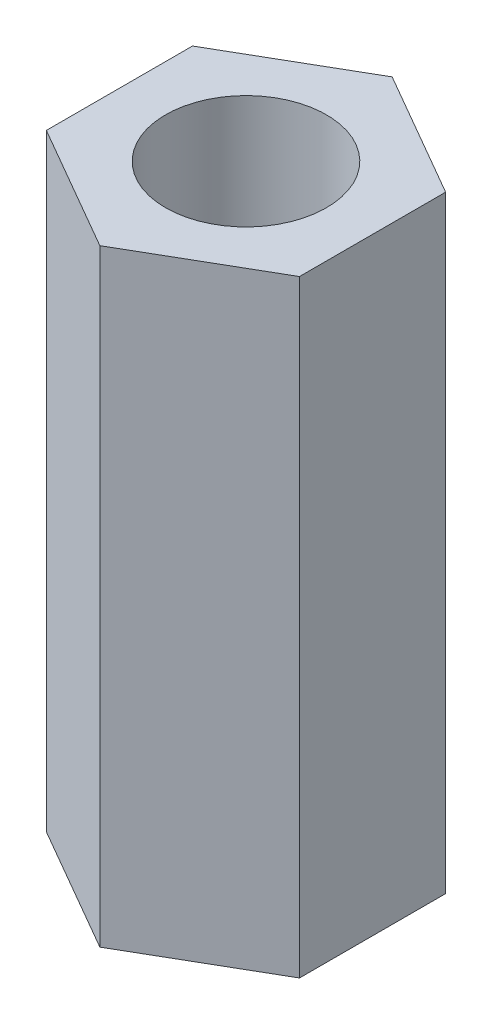
ISO-10303-21;
HEADER;
FILE_DESCRIPTION(('STEP AP214'),'2;1');
FILE_NAME('part.step','',(''),(''),'','','');
FILE_SCHEMA(('AUTOMOTIVE_DESIGN { 1 0 10303 214 1 1 1 1 }'));
ENDSEC;
DATA;
#1=APPLICATION_CONTEXT('core data for automotive mechanical design processes');
#2=APPLICATION_PROTOCOL_DEFINITION('international standard','automotive_design',2000,#1);
#3=PRODUCT_CONTEXT('',#1,'mechanical');
#4=PRODUCT('Part','Part','',(#3));
#5=PRODUCT_RELATED_PRODUCT_CATEGORY('part','',(#4));
#6=PRODUCT_DEFINITION_FORMATION('','',#4);
#7=PRODUCT_DEFINITION_CONTEXT('part definition',#1,'design');
#8=PRODUCT_DEFINITION('design','',#6,#7);
#9=PRODUCT_DEFINITION_SHAPE('','',#8);
#10=(LENGTH_UNIT() NAMED_UNIT(*) SI_UNIT(.MILLI.,.METRE.));
#11=(NAMED_UNIT(*) PLANE_ANGLE_UNIT() SI_UNIT($,.RADIAN.));
#12=(NAMED_UNIT(*) SI_UNIT($,.STERADIAN.) SOLID_ANGLE_UNIT());
#13=UNCERTAINTY_MEASURE_WITH_UNIT(LENGTH_MEASURE(1.E-05),#10,'distance_accuracy_value','');
#14=(GEOMETRIC_REPRESENTATION_CONTEXT(3) GLOBAL_UNCERTAINTY_ASSIGNED_CONTEXT((#13)) GLOBAL_UNIT_ASSIGNED_CONTEXT((#10,
#11,#12)) REPRESENTATION_CONTEXT('',''));
#15=CARTESIAN_POINT('',(0.,0.,0.));
#16=DIRECTION('',(0.,0.,1.));
#17=DIRECTION('',(1.,0.,0.));
#18=AXIS2_PLACEMENT_3D('',#15,#16,#17);
#19=CARTESIAN_POINT('',(0.,12.,0.));
#20=DIRECTION('',(0.,-1.,0.));
#21=DIRECTION('',(0.,0.,-1.));
#22=AXIS2_PLACEMENT_3D('',#19,#20,#21);
#23=PLANE('',#22);
#24=DIRECTION('',(-0.866025403784439,0.,0.5));
#25=VECTOR('',#24,1.);
#26=CARTESIAN_POINT('',(-2.50021534072567,12.,-1.4435));
#27=LINE('',#26,#25);
#28=CARTESIAN_POINT('',(0.,12.,-2.887));
#29=VERTEX_POINT('',#28);
#30=CARTESIAN_POINT('',(-2.50021534072567,12.,-1.4435));
#31=VERTEX_POINT('',#30);
#32=EDGE_CURVE('E130',#29,#31,#27,.T.);
#33=ORIENTED_EDGE('',*,*,#32,.T.);
#34=DIRECTION('',(0.,0.,1.));
#35=VECTOR('',#34,1.);
#36=CARTESIAN_POINT('',(-2.50021534072567,12.,1.4435));
#37=LINE('',#36,#35);
#38=CARTESIAN_POINT('',(-2.50021534072567,12.,1.4435));
#39=VERTEX_POINT('',#38);
#40=EDGE_CURVE('E88',#31,#39,#37,.T.);
#41=ORIENTED_EDGE('',*,*,#40,.T.);
#42=DIRECTION('',(0.866025403784439,0.,0.5));
#43=VECTOR('',#42,1.);
#44=CARTESIAN_POINT('',(0.,12.,2.887));
#45=LINE('',#44,#43);
#46=CARTESIAN_POINT('',(0.,12.,2.887));
#47=VERTEX_POINT('',#46);
#48=EDGE_CURVE('E101',#39,#47,#45,.T.);
#49=ORIENTED_EDGE('',*,*,#48,.T.);
#50=DIRECTION('',(0.866025403784439,0.,-0.5));
#51=VECTOR('',#50,1.);
#52=CARTESIAN_POINT('',(2.50021534072567,12.,1.4435));
#53=LINE('',#52,#51);
#54=CARTESIAN_POINT('',(2.50021534072567,12.,1.4435));
#55=VERTEX_POINT('',#54);
#56=EDGE_CURVE('E95',#47,#55,#53,.T.);
#57=ORIENTED_EDGE('',*,*,#56,.T.);
#58=DIRECTION('',(0.,0.,-1.));
#59=VECTOR('',#58,1.);
#60=CARTESIAN_POINT('',(2.50021534072567,12.,-1.4435));
#61=LINE('',#60,#59);
#62=CARTESIAN_POINT('',(2.50021534072567,12.,-1.4435));
#63=VERTEX_POINT('',#62);
#64=EDGE_CURVE('E99',#55,#63,#61,.T.);
#65=ORIENTED_EDGE('',*,*,#64,.T.);
#66=DIRECTION('',(-0.866025403784439,0.,-0.5));
#67=VECTOR('',#66,1.);
#68=CARTESIAN_POINT('',(0.,12.,-2.887));
#69=LINE('',#68,#67);
#70=EDGE_CURVE('E51',#63,#29,#69,.T.);
#71=ORIENTED_EDGE('',*,*,#70,.T.);
#72=EDGE_LOOP('',(#33,#41,#49,#57,#65,#71));
#73=FACE_BOUND('',#72,.T.);
#74=CARTESIAN_POINT('',(0.,12.,0.));
#75=DIRECTION('',(0.,1.,0.));
#76=DIRECTION('',(0.,0.,1.));
#77=AXIS2_PLACEMENT_3D('',#74,#75,#76);
#78=CIRCLE('',#77,1.59);
#79=CARTESIAN_POINT('',(0.,12.,1.59));
#80=VERTEX_POINT('',#79);
#81=EDGE_CURVE('E123',#80,#80,#78,.T.);
#82=ORIENTED_EDGE('',*,*,#81,.F.);
#83=EDGE_LOOP('',(#82));
#84=FACE_BOUND('',#83,.T.);
#85=ADVANCED_FACE('F34',(#73,#84),#23,.F.);
#86=CARTESIAN_POINT('',(0.,0.,0.));
#87=DIRECTION('',(0.,-1.,0.));
#88=DIRECTION('',(0.,0.,-1.));
#89=AXIS2_PLACEMENT_3D('',#86,#87,#88);
#90=PLANE('',#89);
#91=DIRECTION('',(-0.866025403784439,0.,0.5));
#92=VECTOR('',#91,1.);
#93=CARTESIAN_POINT('',(-2.50021534072567,0.,-1.4435));
#94=LINE('',#93,#92);
#95=CARTESIAN_POINT('',(0.,0.,-2.887));
#96=VERTEX_POINT('',#95);
#97=CARTESIAN_POINT('',(-2.50021534072567,0.,-1.4435));
#98=VERTEX_POINT('',#97);
#99=EDGE_CURVE('E119',#96,#98,#94,.T.);
#100=ORIENTED_EDGE('',*,*,#99,.F.);
#101=DIRECTION('',(-0.866025403784439,0.,-0.5));
#102=VECTOR('',#101,1.);
#103=CARTESIAN_POINT('',(0.,0.,-2.887));
#104=LINE('',#103,#102);
#105=CARTESIAN_POINT('',(2.50021534072567,0.,-1.4435));
#106=VERTEX_POINT('',#105);
#107=EDGE_CURVE('E80',#106,#96,#104,.T.);
#108=ORIENTED_EDGE('',*,*,#107,.F.);
#109=DIRECTION('',(0.,0.,-1.));
#110=VECTOR('',#109,1.);
#111=CARTESIAN_POINT('',(2.50021534072567,0.,-1.4435));
#112=LINE('',#111,#110);
#113=CARTESIAN_POINT('',(2.50021534072567,0.,1.4435));
#114=VERTEX_POINT('',#113);
#115=EDGE_CURVE('E74',#114,#106,#112,.T.);
#116=ORIENTED_EDGE('',*,*,#115,.F.);
#117=DIRECTION('',(0.866025403784439,0.,-0.5));
#118=VECTOR('',#117,1.);
#119=CARTESIAN_POINT('',(2.50021534072567,0.,1.4435));
#120=LINE('',#119,#118);
#121=CARTESIAN_POINT('',(0.,0.,2.887));
#122=VERTEX_POINT('',#121);
#123=EDGE_CURVE('E109',#122,#114,#120,.T.);
#124=ORIENTED_EDGE('',*,*,#123,.F.);
#125=DIRECTION('',(0.866025403784439,0.,0.5));
#126=VECTOR('',#125,1.);
#127=CARTESIAN_POINT('',(0.,0.,2.887));
#128=LINE('',#127,#126);
#129=CARTESIAN_POINT('',(-2.50021534072567,0.,1.4435));
#130=VERTEX_POINT('',#129);
#131=EDGE_CURVE('E125',#130,#122,#128,.T.);
#132=ORIENTED_EDGE('',*,*,#131,.F.);
#133=DIRECTION('',(0.,0.,1.));
#134=VECTOR('',#133,1.);
#135=CARTESIAN_POINT('',(-2.50021534072567,0.,1.4435));
#136=LINE('',#135,#134);
#137=EDGE_CURVE('E122',#98,#130,#136,.T.);
#138=ORIENTED_EDGE('',*,*,#137,.F.);
#139=EDGE_LOOP('',(#100,#108,#116,#124,#132,#138));
#140=FACE_BOUND('',#139,.T.);
#141=CARTESIAN_POINT('',(0.,0.,0.));
#142=DIRECTION('',(0.,1.,0.));
#143=DIRECTION('',(0.,0.,1.));
#144=AXIS2_PLACEMENT_3D('',#141,#142,#143);
#145=CIRCLE('',#144,1.59);
#146=CARTESIAN_POINT('',(0.,0.,1.59));
#147=VERTEX_POINT('',#146);
#148=EDGE_CURVE('E223',#147,#147,#145,.T.);
#149=ORIENTED_EDGE('',*,*,#148,.T.);
#150=EDGE_LOOP('',(#149));
#151=FACE_BOUND('',#150,.T.);
#152=ADVANCED_FACE('F139',(#140,#151),#90,.T.);
#153=CARTESIAN_POINT('',(-2.50021534072567,12.,-1.4435));
#154=DIRECTION('',(0.5,0.,0.866025403784438));
#155=DIRECTION('',(0.866025403784439,0.,-0.5));
#156=AXIS2_PLACEMENT_3D('',#153,#154,#155);
#157=PLANE('',#156);
#158=ORIENTED_EDGE('',*,*,#99,.T.);
#159=DIRECTION('',(0.,-1.,0.));
#160=VECTOR('',#159,1.);
#161=CARTESIAN_POINT('',(-2.50021534072567,12.,-1.4435));
#162=LINE('',#161,#160);
#163=EDGE_CURVE('E11',#31,#98,#162,.T.);
#164=ORIENTED_EDGE('',*,*,#163,.F.);
#165=ORIENTED_EDGE('',*,*,#32,.F.);
#166=DIRECTION('',(0.,-1.,0.));
#167=VECTOR('',#166,1.);
#168=CARTESIAN_POINT('',(0.,12.,-2.887));
#169=LINE('',#168,#167);
#170=EDGE_CURVE('E115',#29,#96,#169,.T.);
#171=ORIENTED_EDGE('',*,*,#170,.T.);
#172=EDGE_LOOP('',(#158,#164,#165,#171));
#173=FACE_BOUND('',#172,.T.);
#174=ADVANCED_FACE('F36',(#173),#157,.F.);
#175=CARTESIAN_POINT('',(-2.50021534072567,12.,1.4435));
#176=DIRECTION('',(1.,0.,0.));
#177=DIRECTION('',(0.,0.,-1.));
#178=AXIS2_PLACEMENT_3D('',#175,#176,#177);
#179=PLANE('',#178);
#180=ORIENTED_EDGE('',*,*,#137,.T.);
#181=DIRECTION('',(0.,-1.,0.));
#182=VECTOR('',#181,1.);
#183=CARTESIAN_POINT('',(-2.50021534072567,12.,1.4435));
#184=LINE('',#183,#182);
#185=EDGE_CURVE('E43',#39,#130,#184,.T.);
#186=ORIENTED_EDGE('',*,*,#185,.F.);
#187=ORIENTED_EDGE('',*,*,#40,.F.);
#188=ORIENTED_EDGE('',*,*,#163,.T.);
#189=EDGE_LOOP('',(#180,#186,#187,#188));
#190=FACE_BOUND('',#189,.T.);
#191=ADVANCED_FACE('F164',(#190),#179,.F.);
#192=CARTESIAN_POINT('',(0.,12.,2.887));
#193=DIRECTION('',(0.5,0.,-0.866025403784438));
#194=DIRECTION('',(-0.866025403784439,0.,-0.5));
#195=AXIS2_PLACEMENT_3D('',#192,#193,#194);
#196=PLANE('',#195);
#197=ORIENTED_EDGE('',*,*,#131,.T.);
#198=DIRECTION('',(0.,-1.,0.));
#199=VECTOR('',#198,1.);
#200=CARTESIAN_POINT('',(0.,12.,2.887));
#201=LINE('',#200,#199);
#202=EDGE_CURVE('E110',#47,#122,#201,.T.);
#203=ORIENTED_EDGE('',*,*,#202,.F.);
#204=ORIENTED_EDGE('',*,*,#48,.F.);
#205=ORIENTED_EDGE('',*,*,#185,.T.);
#206=EDGE_LOOP('',(#197,#203,#204,#205));
#207=FACE_BOUND('',#206,.T.);
#208=ADVANCED_FACE('F136',(#207),#196,.F.);
#209=CARTESIAN_POINT('',(2.50021534072567,12.,1.4435));
#210=DIRECTION('',(-0.5,0.,-0.866025403784439));
#211=DIRECTION('',(-0.866025403784439,0.,0.5));
#212=AXIS2_PLACEMENT_3D('',#209,#210,#211);
#213=PLANE('',#212);
#214=ORIENTED_EDGE('',*,*,#123,.T.);
#215=DIRECTION('',(0.,-1.,0.));
#216=VECTOR('',#215,1.);
#217=CARTESIAN_POINT('',(2.50021534072567,12.,1.4435));
#218=LINE('',#217,#216);
#219=EDGE_CURVE('E106',#55,#114,#218,.T.);
#220=ORIENTED_EDGE('',*,*,#219,.F.);
#221=ORIENTED_EDGE('',*,*,#56,.F.);
#222=ORIENTED_EDGE('',*,*,#202,.T.);
#223=EDGE_LOOP('',(#214,#220,#221,#222));
#224=FACE_BOUND('',#223,.T.);
#225=ADVANCED_FACE('F107',(#224),#213,.F.);
#226=CARTESIAN_POINT('',(2.50021534072567,12.,-1.4435));
#227=DIRECTION('',(-1.,0.,0.));
#228=DIRECTION('',(0.,0.,1.));
#229=AXIS2_PLACEMENT_3D('',#226,#227,#228);
#230=PLANE('',#229);
#231=ORIENTED_EDGE('',*,*,#115,.T.);
#232=DIRECTION('',(0.,-1.,0.));
#233=VECTOR('',#232,1.);
#234=CARTESIAN_POINT('',(2.50021534072567,12.,-1.4435));
#235=LINE('',#234,#233);
#236=EDGE_CURVE('E111',#63,#106,#235,.T.);
#237=ORIENTED_EDGE('',*,*,#236,.F.);
#238=ORIENTED_EDGE('',*,*,#64,.F.);
#239=ORIENTED_EDGE('',*,*,#219,.T.);
#240=EDGE_LOOP('',(#231,#237,#238,#239));
#241=FACE_BOUND('',#240,.T.);
#242=ADVANCED_FACE('F113',(#241),#230,.F.);
#243=CARTESIAN_POINT('',(0.,12.,-2.887));
#244=DIRECTION('',(-0.5,0.,0.866025403784439));
#245=DIRECTION('',(0.866025403784439,0.,0.5));
#246=AXIS2_PLACEMENT_3D('',#243,#244,#245);
#247=PLANE('',#246);
#248=ORIENTED_EDGE('',*,*,#107,.T.);
#249=ORIENTED_EDGE('',*,*,#170,.F.);
#250=ORIENTED_EDGE('',*,*,#70,.F.);
#251=ORIENTED_EDGE('',*,*,#236,.T.);
#252=EDGE_LOOP('',(#248,#249,#250,#251));
#253=FACE_BOUND('',#252,.T.);
#254=ADVANCED_FACE('F144',(#253),#247,.F.);
#255=CARTESIAN_POINT('',(0.,12.,0.));
#256=DIRECTION('',(0.,-1.,0.));
#257=DIRECTION('',(0.,0.,-1.));
#258=AXIS2_PLACEMENT_3D('',#255,#256,#257);
#259=CYLINDRICAL_SURFACE('',#258,1.59);
#260=ORIENTED_EDGE('',*,*,#81,.T.);
#261=EDGE_LOOP('',(#260));
#262=FACE_BOUND('',#261,.T.);
#263=ORIENTED_EDGE('',*,*,#148,.F.);
#264=EDGE_LOOP('',(#263));
#265=FACE_BOUND('',#264,.T.);
#266=ADVANCED_FACE('F146',(#262,#265),#259,.F.);
#267=CLOSED_SHELL('',(#85,#152,#174,#191,#208,#225,#242,#254,#266));
#268=MANIFOLD_SOLID_BREP('B2',#267);
#269=ADVANCED_BREP_SHAPE_REPRESENTATION('',(#18,#268),#14);
#270=SHAPE_DEFINITION_REPRESENTATION(#9,#269);
ENDSEC;
END-ISO-10303-21;
